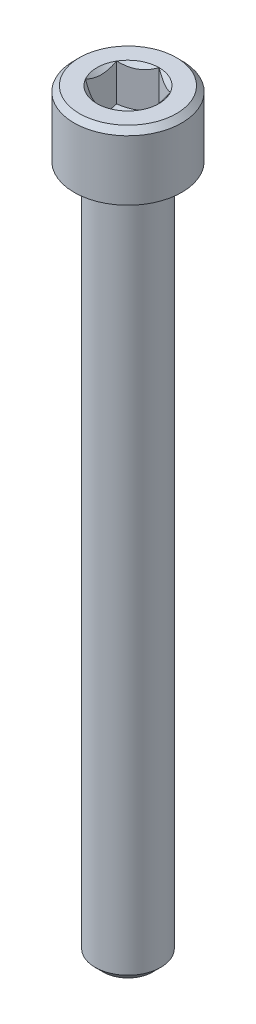
ISO-10303-21;
HEADER;
FILE_DESCRIPTION(('STEP AP214'),'2;1');
FILE_NAME('part.step','',(''),(''),'','','');
FILE_SCHEMA(('AUTOMOTIVE_DESIGN { 1 0 10303 214 1 1 1 1 }'));
ENDSEC;
DATA;
#1=APPLICATION_CONTEXT('core data for automotive mechanical design processes');
#2=APPLICATION_PROTOCOL_DEFINITION('international standard','automotive_design',2000,#1);
#3=PRODUCT_CONTEXT('',#1,'mechanical');
#4=PRODUCT('Part','Part','',(#3));
#5=PRODUCT_RELATED_PRODUCT_CATEGORY('part','',(#4));
#6=PRODUCT_DEFINITION_FORMATION('','',#4);
#7=PRODUCT_DEFINITION_CONTEXT('part definition',#1,'design');
#8=PRODUCT_DEFINITION('design','',#6,#7);
#9=PRODUCT_DEFINITION_SHAPE('','',#8);
#10=(LENGTH_UNIT() NAMED_UNIT(*) SI_UNIT(.MILLI.,.METRE.));
#11=(NAMED_UNIT(*) PLANE_ANGLE_UNIT() SI_UNIT($,.RADIAN.));
#12=(NAMED_UNIT(*) SI_UNIT($,.STERADIAN.) SOLID_ANGLE_UNIT());
#13=UNCERTAINTY_MEASURE_WITH_UNIT(LENGTH_MEASURE(1.E-05),#10,'distance_accuracy_value','');
#14=(GEOMETRIC_REPRESENTATION_CONTEXT(3) GLOBAL_UNCERTAINTY_ASSIGNED_CONTEXT((#13)) GLOBAL_UNIT_ASSIGNED_CONTEXT((#10,
#11,#12)) REPRESENTATION_CONTEXT('',''));
#15=CARTESIAN_POINT('',(0.,0.,0.));
#16=DIRECTION('',(0.,0.,1.));
#17=DIRECTION('',(1.,0.,0.));
#18=AXIS2_PLACEMENT_3D('',#15,#16,#17);
#19=CARTESIAN_POINT('',(0.,4.826,0.));
#20=DIRECTION('',(0.,1.,0.));
#21=DIRECTION('',(0.,0.,1.));
#22=AXIS2_PLACEMENT_3D('',#19,#20,#21);
#23=CONICAL_SURFACE('',#22,2.29135888084632,0.785398163397448);
#24=CARTESIAN_POINT('',(1.984575,4.82611547878185,1.14556397036933));
#25=CARTESIAN_POINT('',(1.9163590048332,4.78676285226392,1.18494849354192));
#26=CARTESIAN_POINT('',(1.84700231489304,4.74972131044619,1.22499159714897));
#27=CARTESIAN_POINT('',(1.70557619954781,4.68189885842333,1.30664400291398));
#28=CARTESIAN_POINT('',(1.63349332126322,4.65115568909176,1.34826107209555));
#29=CARTESIAN_POINT('',(1.488141602734,4.59849188881121,1.43217992591557));
#30=CARTESIAN_POINT('',(1.41490978751306,4.57643887587997,1.47446033414662));
#31=CARTESIAN_POINT('',(1.2668338174053,4.54246149294388,1.55995203534886));
#32=CARTESIAN_POINT('',(1.19199418724658,4.53051175609173,1.60316071596704));
#33=CARTESIAN_POINT('',(1.06301458545619,4.51973009908191,1.6776271237807));
#34=CARTESIAN_POINT('',(1.00904128422756,4.51813389905907,1.7087886237741));
#35=CARTESIAN_POINT('',(0.901182881480204,4.52082183886529,1.77106070163465));
#36=CARTESIAN_POINT('',(0.847297817514481,4.52510804034046,1.80217125782056));
#37=CARTESIAN_POINT('',(0.7400364617514,4.53931687301352,1.86409863044402));
#38=CARTESIAN_POINT('',(0.686660807239864,4.54924581045227,1.89491507894443));
#39=CARTESIAN_POINT('',(0.580832482591108,4.57419508427454,1.95601509066827));
#40=CARTESIAN_POINT('',(0.528379742028904,4.58921503038949,1.9862986945516));
#41=CARTESIAN_POINT('',(0.394017661036358,4.63380785163567,2.06387267818152));
#42=CARTESIAN_POINT('',(0.312941642841681,4.66674299593833,2.11068193911104));
#43=CARTESIAN_POINT('',(0.193726693270167,4.7223424412022,2.17951072233758));
#44=CARTESIAN_POINT('',(0.154440075614005,4.74187759205186,2.20219286161692));
#45=CARTESIAN_POINT('',(0.0765946381319541,4.7827287381194,2.24713694590236));
#46=CARTESIAN_POINT('',(0.0380353888983083,4.80404363956835,2.26939913882716));
#47=CARTESIAN_POINT('',(-0.000199999999994045,4.82611547878184,2.29147435090016));
#48=B_SPLINE_CURVE_WITH_KNOTS('',3,(#24,#25,#26,#27,#28,#29,#30,#31,#32,#33,#34,#35,#36,#37,#38,
#39,#40,#41,#42,#43,#44,#45,#46,#47),.UNSPECIFIED.,.F.,.F.,(4,2,2,2,2,2,2,2,2,2,2,4),(0.,
0.264339630306627,0.530219665093694,0.791876416371459,1.05287424418109,1.239639843932,
1.42647091743852,1.61351120244034,1.8005371524754,2.09764209964316,2.24579179873713,
2.39385111134156),.UNSPECIFIED.);
#49=CARTESIAN_POINT('',(1.984375,4.826,1.14567944042316));
#50=VERTEX_POINT('',#49);
#51=CARTESIAN_POINT('',(0.,4.826,2.29135888084632));
#52=VERTEX_POINT('',#51);
#53=EDGE_CURVE('E190',#50,#52,#48,.T.);
#54=ORIENTED_EDGE('',*,*,#53,.T.);
#55=CARTESIAN_POINT('',(0.,4.826,0.));
#56=DIRECTION('',(0.,1.,0.));
#57=DIRECTION('',(0.,0.,1.));
#58=AXIS2_PLACEMENT_3D('',#55,#56,#57);
#59=CIRCLE('',#58,2.29135888084632);
#60=EDGE_CURVE('E264',#52,#50,#59,.T.);
#61=ORIENTED_EDGE('',*,*,#60,.T.);
#62=EDGE_LOOP('',(#54,#61));
#63=FACE_BOUND('',#62,.T.);
#64=ADVANCED_FACE('F17',(#63),#23,.F.);
#65=CARTESIAN_POINT('',(-1.984375,4.826,1.14567944042317));
#66=VERTEX_POINT('',#65);
#67=EDGE_CURVE('E263',#66,#52,#59,.T.);
#68=ORIENTED_EDGE('',*,*,#67,.T.);
#69=CARTESIAN_POINT('',(0.000200000000006041,4.82611547878185,2.29147435090017));
#70=CARTESIAN_POINT('',(-0.0680159951667965,4.78676285226392,2.25208982772758));
#71=CARTESIAN_POINT('',(-0.13737268510696,4.74972131044619,2.21204672412052));
#72=CARTESIAN_POINT('',(-0.278798800452183,4.68189885842333,2.13039431835552));
#73=CARTESIAN_POINT('',(-0.350881678736778,4.65115568909176,2.08877724917394));
#74=CARTESIAN_POINT('',(-0.496233397266,4.59849188881122,2.00485839535392));
#75=CARTESIAN_POINT('',(-0.569465212486935,4.57643887587997,1.96257798712287));
#76=CARTESIAN_POINT('',(-0.717541182594702,4.54246149294388,1.87708628592063));
#77=CARTESIAN_POINT('',(-0.792380812753421,4.53051175609173,1.83387760530245));
#78=CARTESIAN_POINT('',(-0.921360414543811,4.51973009908191,1.75941119748879));
#79=CARTESIAN_POINT('',(-0.975333715772438,4.51813389905907,1.72824969749539));
#80=CARTESIAN_POINT('',(-1.0831921185198,4.52082183886529,1.66597761963484));
#81=CARTESIAN_POINT('',(-1.13707718248552,4.52510804034046,1.63486706344893));
#82=CARTESIAN_POINT('',(-1.2443385382486,4.53931687301352,1.57293969082547));
#83=CARTESIAN_POINT('',(-1.29771419276014,4.54924581045227,1.54212324232506));
#84=CARTESIAN_POINT('',(-1.40354251740889,4.57419508427454,1.48102323060122));
#85=CARTESIAN_POINT('',(-1.4559952579711,4.58921503038949,1.4507396267179));
#86=CARTESIAN_POINT('',(-1.59035733896364,4.63380785163567,1.37316564308797));
#87=CARTESIAN_POINT('',(-1.67143335715832,4.66674299593833,1.32635638215845));
#88=CARTESIAN_POINT('',(-1.79064830672984,4.7223424412022,1.25752759893191));
#89=CARTESIAN_POINT('',(-1.829934924386,4.74187759205186,1.23484545965257));
#90=CARTESIAN_POINT('',(-1.90778036186805,4.7827287381194,1.18990137536713));
#91=CARTESIAN_POINT('',(-1.9463396111017,4.80404363956835,1.16763918244233));
#92=CARTESIAN_POINT('',(-1.984575,4.82611547878184,1.14556397036933));
#93=B_SPLINE_CURVE_WITH_KNOTS('',3,(#69,#70,#71,#72,#73,#74,#75,#76,#77,#78,#79,#80,#81,#82,#83,
#84,#85,#86,#87,#88,#89,#90,#91,#92),.UNSPECIFIED.,.F.,.F.,(4,2,2,2,2,2,2,2,2,2,2,4),(0.,
0.264339630306629,0.530219665093699,0.791876416371465,1.0528742441811,1.23963984393201,
1.42647091743853,1.61351120244035,1.80053715247541,2.09764209964317,2.24579179873714,
2.39385111134158),.UNSPECIFIED.);
#94=EDGE_CURVE('E196',#52,#66,#93,.T.);
#95=ORIENTED_EDGE('',*,*,#94,.T.);
#96=EDGE_LOOP('',(#68,#95));
#97=FACE_BOUND('',#96,.T.);
#98=ADVANCED_FACE('F226',(#97),#23,.F.);
#99=CARTESIAN_POINT('',(1.984375,6.52130748324644,-3.45771088409132));
#100=CARTESIAN_POINT('',(1.984375,6.43262944586762,-3.35542683330867));
#101=CARTESIAN_POINT('',(1.984375,6.34446536162983,-3.25268780387356));
#102=CARTESIAN_POINT('',(1.984375,6.16953159373914,-3.04594702957406));
#103=CARTESIAN_POINT('',(1.984375,6.08276259352516,-2.94194470714936));
#104=CARTESIAN_POINT('',(1.984375,5.90909527980482,-2.73001070946145));
#105=CARTESIAN_POINT('',(1.984375,5.822239934163,-2.62204368545491));
#106=CARTESIAN_POINT('',(1.984375,5.65116778000237,-2.40407276272223));
#107=CARTESIAN_POINT('',(1.984375,5.56695031553371,-2.29406938136794));
#108=CARTESIAN_POINT('',(1.984375,5.402042566665,-2.07120370981882));
#109=CARTESIAN_POINT('',(1.984375,5.32135716597924,-1.95833778205997));
#110=CARTESIAN_POINT('',(1.984375,5.16517668266955,-1.72888861173673));
#111=CARTESIAN_POINT('',(1.984375,5.08968585678648,-1.61230243243413));
#112=CARTESIAN_POINT('',(1.984375,4.947134431062,-1.37524803754826));
#113=CARTESIAN_POINT('',(1.984375,4.8800132606332,-1.25481673054247));
#114=CARTESIAN_POINT('',(1.984375,4.75778822517673,-1.00801151762188));
#115=CARTESIAN_POINT('',(1.984375,4.70266224970091,-0.881649076411233));
#116=CARTESIAN_POINT('',(1.984375,4.63323107564838,-0.685684715970748));
#117=CARTESIAN_POINT('',(1.984375,4.61213776738587,-0.61849922209624));
#118=CARTESIAN_POINT('',(1.984375,4.57579445135076,-0.482546235656734));
#119=CARTESIAN_POINT('',(1.984375,4.56054351090578,-0.41377899746012));
#120=CARTESIAN_POINT('',(1.984375,4.53689825717652,-0.275490831109884));
#121=CARTESIAN_POINT('',(1.984375,4.52846218390903,-0.205977179571448));
#122=CARTESIAN_POINT('',(1.984375,4.51890880020465,-0.0664443832858304));
#123=CARTESIAN_POINT('',(1.984375,4.51779072084056,0.0035747075790733));
#124=CARTESIAN_POINT('',(1.984375,4.52296292884912,0.143424006703544));
#125=CARTESIAN_POINT('',(1.984375,4.52926289019542,0.213253849018881));
#126=CARTESIAN_POINT('',(1.984375,4.54881043261024,0.351927006353266));
#127=CARTESIAN_POINT('',(1.984375,4.56205938187111,0.420770124352072));
#128=CARTESIAN_POINT('',(1.984375,4.59475382728509,0.55745949001931));
#129=CARTESIAN_POINT('',(1.984375,4.61424263881878,0.625295193543097));
#130=CARTESIAN_POINT('',(1.984375,4.6583635263663,0.759246417792874));
#131=CARTESIAN_POINT('',(1.984375,4.68299565938668,0.825361919443687));
#132=CARTESIAN_POINT('',(1.984375,4.74245510304685,0.970580741117793));
#133=CARTESIAN_POINT('',(1.984375,4.77832893658829,1.04925193970017));
#134=CARTESIAN_POINT('',(1.984375,4.85486121641692,1.20425175336704));
#135=CARTESIAN_POINT('',(1.984375,4.89552242697314,1.28057898264071));
#136=CARTESIAN_POINT('',(1.984375,4.98056622739607,1.43132281685668));
#137=CARTESIAN_POINT('',(1.984375,5.02495635189839,1.50573513623634));
#138=CARTESIAN_POINT('',(1.984375,5.1165292817791,1.65278836739454));
#139=CARTESIAN_POINT('',(1.984375,5.16371153170412,1.72542962746702));
#140=CARTESIAN_POINT('',(1.984375,5.26051114971045,1.86962401155094));
#141=CARTESIAN_POINT('',(1.984375,5.31014010813647,1.9411693187575));
#142=CARTESIAN_POINT('',(1.984375,5.41114100200018,2.08302186505396));
#143=CARTESIAN_POINT('',(1.984375,5.46251306880154,2.1533290102246));
#144=CARTESIAN_POINT('',(1.984375,5.61857454823435,2.36253483271691));
#145=CARTESIAN_POINT('',(1.984375,5.72532842618644,2.49989159715618));
#146=CARTESIAN_POINT('',(1.984375,5.94598591328433,2.77607806575545));
#147=CARTESIAN_POINT('',(1.984375,6.06000910834152,2.91481128320863));
#148=CARTESIAN_POINT('',(1.984375,6.23243856402619,3.12046871280676));
#149=CARTESIAN_POINT('',(1.984375,6.28982890842778,3.1882488408292));
#150=CARTESIAN_POINT('',(1.984375,6.40517040906205,3.32332427251419));
#151=CARTESIAN_POINT('',(1.984375,6.46312153554217,3.39061960157108));
#152=CARTESIAN_POINT('',(1.984375,6.52130748324643,3.45771088409131));
#153=B_SPLINE_CURVE_WITH_KNOTS('',3,(#99,#100,#101,#102,#103,#104,#105,#106,#107,#108,#109,#110,
#111,#112,#113,#114,#115,#116,#117,#118,#119,#120,#121,#122,#123,#124,#125,#126,#127,#128,#129,
#130,#131,#132,#133,#134,#135,#136,#137,#138,#139,#140,#141,#142,#143,#144,#145,#146,#147,#148,
#149,#150,#151,#152),.UNSPECIFIED.,.F.,.F.,(4,2,2,2,2,2,2,2,2,2,2,2,2,2,2,2,2,2,2,2,2,2,2,2,2,2,
4),(0.,0.406127590682087,0.812448423474263,1.2281189762356,1.64368533200276,2.05980921904513,
2.47627013871692,2.88951664651822,3.30199485039354,3.51304063418481,3.72405271268915,
3.93376173343452,4.14344871896586,4.35340946345541,4.5634115628274,4.77490424990243,
4.98639928120368,5.24557242311816,5.50489595439299,5.76475669481382,6.02456591232051,
6.28575340350717,6.54696062214586,7.06874360549045,7.6074336441421,7.87387094807471,
8.1402941927268),.UNSPECIFIED.);
#154=CARTESIAN_POINT('',(1.984375,4.826,-1.14567944042317));
#155=VERTEX_POINT('',#154);
#156=EDGE_CURVE('E125',#155,#50,#153,.T.);
#157=ORIENTED_EDGE('',*,*,#156,.T.);
#158=EDGE_CURVE('E261',#50,#155,#59,.T.);
#159=ORIENTED_EDGE('',*,*,#158,.T.);
#160=EDGE_LOOP('',(#157,#159));
#161=FACE_BOUND('',#160,.T.);
#162=ADVANCED_FACE('F231',(#161),#23,.F.);
#163=CARTESIAN_POINT('',(-1.984375,4.826,-1.14567944042317));
#164=VERTEX_POINT('',#163);
#165=EDGE_CURVE('E259',#164,#66,#59,.T.);
#166=ORIENTED_EDGE('',*,*,#165,.T.);
#167=CARTESIAN_POINT('',(-1.984375,6.52130748324645,3.45771088409133));
#168=CARTESIAN_POINT('',(-1.984375,6.43262944586763,3.35542683330868));
#169=CARTESIAN_POINT('',(-1.984375,6.34446536162984,3.25268780387358));
#170=CARTESIAN_POINT('',(-1.984375,6.16953159373915,3.04594702957407));
#171=CARTESIAN_POINT('',(-1.984375,6.08276259352517,2.94194470714937));
#172=CARTESIAN_POINT('',(-1.984375,5.90909527980482,2.73001070946146));
#173=CARTESIAN_POINT('',(-1.984375,5.822239934163,2.62204368545493));
#174=CARTESIAN_POINT('',(-1.984375,5.65116778000238,2.40407276272225));
#175=CARTESIAN_POINT('',(-1.984375,5.56695031553373,2.29406938136795));
#176=CARTESIAN_POINT('',(-1.984375,5.40204256666501,2.07120370981883));
#177=CARTESIAN_POINT('',(-1.984375,5.32135716597925,1.95833778205998));
#178=CARTESIAN_POINT('',(-1.984375,5.16517668266955,1.72888861173674));
#179=CARTESIAN_POINT('',(-1.984375,5.08968585678649,1.61230243243414));
#180=CARTESIAN_POINT('',(-1.984375,4.947134431062,1.37524803754827));
#181=CARTESIAN_POINT('',(-1.984375,4.88001326063321,1.25481673054247));
#182=CARTESIAN_POINT('',(-1.984375,4.75778822517673,1.00801151762189));
#183=CARTESIAN_POINT('',(-1.984375,4.70266224970091,0.881649076411242));
#184=CARTESIAN_POINT('',(-1.984375,4.63323107564838,0.685684715970757));
#185=CARTESIAN_POINT('',(-1.984375,4.61213776738587,0.618499222096249));
#186=CARTESIAN_POINT('',(-1.984375,4.57579445135076,0.482546235656741));
#187=CARTESIAN_POINT('',(-1.984375,4.56054351090578,0.413778997460127));
#188=CARTESIAN_POINT('',(-1.984375,4.53689825717652,0.275490831109891));
#189=CARTESIAN_POINT('',(-1.984375,4.52846218390903,0.205977179571455));
#190=CARTESIAN_POINT('',(-1.984375,4.51890880020465,0.0664443832858369));
#191=CARTESIAN_POINT('',(-1.984375,4.51779072084056,-0.00357470757906708));
#192=CARTESIAN_POINT('',(-1.984375,4.52296292884912,-0.143424006703538));
#193=CARTESIAN_POINT('',(-1.984375,4.52926289019542,-0.213253849018876));
#194=CARTESIAN_POINT('',(-1.984375,4.54881043261024,-0.351927006353261));
#195=CARTESIAN_POINT('',(-1.984375,4.56205938187111,-0.420770124352067));
#196=CARTESIAN_POINT('',(-1.984375,4.59475382728509,-0.557459490019306));
#197=CARTESIAN_POINT('',(-1.984375,4.61424263881878,-0.625295193543094));
#198=CARTESIAN_POINT('',(-1.984375,4.6583635263663,-0.759246417792871));
#199=CARTESIAN_POINT('',(-1.984375,4.68299565938668,-0.825361919443685));
#200=CARTESIAN_POINT('',(-1.984375,4.74245510304685,-0.970580741117791));
#201=CARTESIAN_POINT('',(-1.984375,4.77832893658829,-1.04925193970017));
#202=CARTESIAN_POINT('',(-1.984375,4.85486121641691,-1.20425175336703));
#203=CARTESIAN_POINT('',(-1.984375,4.89552242697314,-1.28057898264071));
#204=CARTESIAN_POINT('',(-1.984375,4.98056622739607,-1.43132281685667));
#205=CARTESIAN_POINT('',(-1.984375,5.02495635189838,-1.50573513623633));
#206=CARTESIAN_POINT('',(-1.984375,5.1165292817791,-1.65278836739453));
#207=CARTESIAN_POINT('',(-1.984375,5.16371153170412,-1.72542962746701));
#208=CARTESIAN_POINT('',(-1.984375,5.26051114971045,-1.86962401155093));
#209=CARTESIAN_POINT('',(-1.984375,5.31014010813646,-1.9411693187575));
#210=CARTESIAN_POINT('',(-1.984375,5.41114100200017,-2.08302186505395));
#211=CARTESIAN_POINT('',(-1.984375,5.46251306880154,-2.15332901022459));
#212=CARTESIAN_POINT('',(-1.984375,5.61857454823435,-2.3625348327169));
#213=CARTESIAN_POINT('',(-1.984375,5.72532842618643,-2.49989159715617));
#214=CARTESIAN_POINT('',(-1.984375,5.94598591328432,-2.77607806575545));
#215=CARTESIAN_POINT('',(-1.984375,6.06000910834152,-2.91481128320863));
#216=CARTESIAN_POINT('',(-1.984375,6.2324385640262,-3.12046871280677));
#217=CARTESIAN_POINT('',(-1.984375,6.2898289084278,-3.18824884082921));
#218=CARTESIAN_POINT('',(-1.984375,6.40517040906206,-3.32332427251421));
#219=CARTESIAN_POINT('',(-1.984375,6.46312153554218,-3.3906196015711));
#220=CARTESIAN_POINT('',(-1.984375,6.52130748324645,-3.45771088409133));
#221=B_SPLINE_CURVE_WITH_KNOTS('',3,(#167,#168,#169,#170,#171,#172,#173,#174,#175,#176,#177,
#178,#179,#180,#181,#182,#183,#184,#185,#186,#187,#188,#189,#190,#191,#192,#193,#194,#195,#196,
#197,#198,#199,#200,#201,#202,#203,#204,#205,#206,#207,#208,#209,#210,#211,#212,#213,#214,#215,
#216,#217,#218,#219,#220),.UNSPECIFIED.,.F.,.F.,(4,2,2,2,2,2,2,2,2,2,2,2,2,2,2,2,2,2,2,2,2,2,2,
2,2,2,4),(0.,0.406127590682087,0.812448423474264,1.2281189762356,1.64368533200276,
2.05980921904514,2.47627013871693,2.88951664651823,3.30199485039355,3.51304063418482,
3.72405271268916,3.93376173343454,4.14344871896587,4.35340946345543,4.56341156282742,
4.77490424990244,4.9863992812037,5.24557242311818,5.504895954393,5.76475669481384,
6.02456591232052,6.28575340350718,6.54696062214588,7.06874360549046,7.60743364414213,
7.87387094807475,8.14029419272685),.UNSPECIFIED.);
#222=EDGE_CURVE('E206',#66,#164,#221,.T.);
#223=ORIENTED_EDGE('',*,*,#222,.T.);
#224=EDGE_LOOP('',(#166,#223));
#225=FACE_BOUND('',#224,.T.);
#226=ADVANCED_FACE('F244',(#225),#23,.F.);
#227=CARTESIAN_POINT('',(0.,4.826,-2.29135888084632));
#228=VERTEX_POINT('',#227);
#229=EDGE_CURVE('E255',#228,#164,#59,.T.);
#230=ORIENTED_EDGE('',*,*,#229,.T.);
#231=CARTESIAN_POINT('',(-1.984575,4.82611547878184,-1.14556397036933));
#232=CARTESIAN_POINT('',(-1.9163590048332,4.78676285226391,-1.18494849354192));
#233=CARTESIAN_POINT('',(-1.84700231489303,4.74972131044619,-1.22499159714897));
#234=CARTESIAN_POINT('',(-1.70557619954781,4.68189885842332,-1.30664400291398));
#235=CARTESIAN_POINT('',(-1.63349332126322,4.65115568909175,-1.34826107209555));
#236=CARTESIAN_POINT('',(-1.488141602734,4.59849188881121,-1.43217992591557));
#237=CARTESIAN_POINT('',(-1.41490978751306,4.57643887587997,-1.47446033414662));
#238=CARTESIAN_POINT('',(-1.2668338174053,4.54246149294388,-1.55995203534886));
#239=CARTESIAN_POINT('',(-1.19199418724658,4.53051175609173,-1.60316071596704));
#240=CARTESIAN_POINT('',(-1.06301458545619,4.51973009908191,-1.6776271237807));
#241=CARTESIAN_POINT('',(-1.00904128422756,4.51813389905907,-1.7087886237741));
#242=CARTESIAN_POINT('',(-0.901182881480203,4.52082183886529,-1.77106070163465));
#243=CARTESIAN_POINT('',(-0.84729781751448,4.52510804034046,-1.80217125782056));
#244=CARTESIAN_POINT('',(-0.740036461751399,4.53931687301352,-1.86409863044402));
#245=CARTESIAN_POINT('',(-0.686660807239862,4.54924581045227,-1.89491507894443));
#246=CARTESIAN_POINT('',(-0.580832482591107,4.57419508427454,-1.95601509066827));
#247=CARTESIAN_POINT('',(-0.528379742028903,4.58921503038949,-1.9862986945516));
#248=CARTESIAN_POINT('',(-0.394017661036357,4.63380785163567,-2.06387267818152));
#249=CARTESIAN_POINT('',(-0.31294164284168,4.66674299593833,-2.11068193911104));
#250=CARTESIAN_POINT('',(-0.193726693270166,4.7223424412022,-2.17951072233758));
#251=CARTESIAN_POINT('',(-0.154440075614005,4.74187759205186,-2.20219286161691));
#252=CARTESIAN_POINT('',(-0.0765946381319542,4.7827287381194,-2.24713694590236));
#253=CARTESIAN_POINT('',(-0.038035388898309,4.80404363956835,-2.26939913882716));
#254=CARTESIAN_POINT('',(0.000199999999992446,4.82611547878184,-2.29147435090016));
#255=B_SPLINE_CURVE_WITH_KNOTS('',3,(#231,#232,#233,#234,#235,#236,#237,#238,#239,#240,#241,
#242,#243,#244,#245,#246,#247,#248,#249,#250,#251,#252,#253,#254),.UNSPECIFIED.,.F.,.F.,(4,2,2,
2,2,2,2,2,2,2,2,4),(0.,0.264339630306625,0.530219665093691,0.791876416371454,1.05287424418108,
1.23963984393199,1.42647091743851,1.61351120244034,1.80053715247539,2.09764209964315,
2.24579179873712,2.39385111134156),.UNSPECIFIED.);
#256=EDGE_CURVE('E96',#164,#228,#255,.T.);
#257=ORIENTED_EDGE('',*,*,#256,.T.);
#258=EDGE_LOOP('',(#230,#257));
#259=FACE_BOUND('',#258,.T.);
#260=ADVANCED_FACE('F235',(#259),#23,.F.);
#261=CARTESIAN_POINT('',(0.,-25.0436663954414,0.));
#262=DIRECTION('',(0.,1.,0.));
#263=DIRECTION('',(0.,0.,1.));
#264=AXIS2_PLACEMENT_3D('',#261,#262,#263);
#265=CYLINDRICAL_SURFACE('',#264,3.96875);
#266=CARTESIAN_POINT('',(0.,4.429125,0.));
#267=DIRECTION('',(0.,1.,0.));
#268=DIRECTION('',(0.,0.,1.));
#269=AXIS2_PLACEMENT_3D('',#266,#267,#268);
#270=CIRCLE('',#269,3.96875);
#271=CARTESIAN_POINT('',(0.,4.429125,3.96875));
#272=VERTEX_POINT('',#271);
#273=EDGE_CURVE('E212',#272,#272,#270,.T.);
#274=ORIENTED_EDGE('',*,*,#273,.F.);
#275=EDGE_LOOP('',(#274));
#276=FACE_BOUND('',#275,.T.);
#277=CARTESIAN_POINT('',(0.,0.,0.));
#278=DIRECTION('',(0.,1.,0.));
#279=DIRECTION('',(0.,0.,1.));
#280=AXIS2_PLACEMENT_3D('',#277,#278,#279);
#281=CIRCLE('',#280,3.96875);
#282=CARTESIAN_POINT('',(0.,0.,3.96875));
#283=VERTEX_POINT('',#282);
#284=EDGE_CURVE('E11',#283,#283,#281,.T.);
#285=ORIENTED_EDGE('',*,*,#284,.T.);
#286=EDGE_LOOP('',(#285));
#287=FACE_BOUND('',#286,.T.);
#288=ADVANCED_FACE('F19',(#276,#287),#265,.T.);
#289=CARTESIAN_POINT('',(0.,0.,3.254375));
#290=DIRECTION('',(0.,1.,0.));
#291=DIRECTION('',(0.,0.,1.));
#292=AXIS2_PLACEMENT_3D('',#289,#290,#291);
#293=PLANE('',#292);
#294=ORIENTED_EDGE('',*,*,#284,.F.);
#295=EDGE_LOOP('',(#294));
#296=FACE_BOUND('',#295,.T.);
#297=CARTESIAN_POINT('',(0.,0.,0.));
#298=DIRECTION('',(0.,1.,0.));
#299=DIRECTION('',(0.,0.,1.));
#300=AXIS2_PLACEMENT_3D('',#297,#298,#299);
#301=CIRCLE('',#300,2.54);
#302=CARTESIAN_POINT('',(0.,0.,2.54));
#303=VERTEX_POINT('',#302);
#304=EDGE_CURVE('E25',#303,#303,#301,.T.);
#305=ORIENTED_EDGE('',*,*,#304,.T.);
#306=EDGE_LOOP('',(#305));
#307=FACE_BOUND('',#306,.T.);
#308=ADVANCED_FACE('F250',(#296,#307),#293,.F.);
#309=CARTESIAN_POINT('',(0.,-0.127,0.));
#310=DIRECTION('',(0.,1.,0.));
#311=DIRECTION('',(0.,0.,1.));
#312=AXIS2_PLACEMENT_3D('',#309,#310,#311);
#313=TOROIDAL_SURFACE('',#312,2.54,0.127);
#314=ORIENTED_EDGE('',*,*,#304,.F.);
#315=EDGE_LOOP('',(#314));
#316=FACE_BOUND('',#315,.T.);
#317=CARTESIAN_POINT('',(0.,-0.126999999999999,0.));
#318=DIRECTION('',(0.,1.,0.));
#319=DIRECTION('',(0.,0.,1.));
#320=AXIS2_PLACEMENT_3D('',#317,#318,#319);
#321=CIRCLE('',#320,2.413);
#322=CARTESIAN_POINT('',(0.,-0.126999999999999,2.413));
#323=VERTEX_POINT('',#322);
#324=EDGE_CURVE('E274',#323,#323,#321,.T.);
#325=ORIENTED_EDGE('',*,*,#324,.T.);
#326=EDGE_LOOP('',(#325));
#327=FACE_BOUND('',#326,.T.);
#328=ADVANCED_FACE('F280',(#316,#327),#313,.F.);
#329=CARTESIAN_POINT('',(0.,-25.0436663954414,0.));
#330=DIRECTION('',(0.,1.,0.));
#331=DIRECTION('',(0.,0.,1.));
#332=AXIS2_PLACEMENT_3D('',#329,#330,#331);
#333=CYLINDRICAL_SURFACE('',#332,2.413);
#334=ORIENTED_EDGE('',*,*,#324,.F.);
#335=EDGE_LOOP('',(#334));
#336=FACE_BOUND('',#335,.T.);
#337=CARTESIAN_POINT('',(0.,-50.2031,0.));
#338=DIRECTION('',(0.,1.,0.));
#339=DIRECTION('',(0.,0.,1.));
#340=AXIS2_PLACEMENT_3D('',#337,#338,#339);
#341=CIRCLE('',#340,2.413);
#342=CARTESIAN_POINT('',(0.,-50.2031,2.41299999999999));
#343=VERTEX_POINT('',#342);
#344=EDGE_CURVE('E271',#343,#343,#341,.T.);
#345=ORIENTED_EDGE('',*,*,#344,.T.);
#346=EDGE_LOOP('',(#345));
#347=FACE_BOUND('',#346,.T.);
#348=ADVANCED_FACE('F283',(#336,#347),#333,.T.);
#349=CARTESIAN_POINT('',(0.,-50.8,0.));
#350=DIRECTION('',(0.,1.,0.));
#351=DIRECTION('',(0.,0.,1.));
#352=AXIS2_PLACEMENT_3D('',#349,#350,#351);
#353=CONICAL_SURFACE('',#352,1.8161,0.785398163397457);
#354=ORIENTED_EDGE('',*,*,#344,.F.);
#355=EDGE_LOOP('',(#354));
#356=FACE_BOUND('',#355,.T.);
#357=CARTESIAN_POINT('',(0.,-50.8,0.));
#358=DIRECTION('',(0.,1.,0.));
#359=DIRECTION('',(0.,0.,1.));
#360=AXIS2_PLACEMENT_3D('',#357,#358,#359);
#361=CIRCLE('',#360,1.8161);
#362=CARTESIAN_POINT('',(0.,-50.8,1.81609999999999));
#363=VERTEX_POINT('',#362);
#364=EDGE_CURVE('E267',#363,#363,#361,.T.);
#365=ORIENTED_EDGE('',*,*,#364,.T.);
#366=EDGE_LOOP('',(#365));
#367=FACE_BOUND('',#366,.T.);
#368=ADVANCED_FACE('F241',(#356,#367),#353,.T.);
#369=CARTESIAN_POINT('',(0.,-50.8,0.90805));
#370=DIRECTION('',(0.,1.,0.));
#371=DIRECTION('',(0.,0.,1.));
#372=AXIS2_PLACEMENT_3D('',#369,#370,#371);
#373=PLANE('',#372);
#374=ORIENTED_EDGE('',*,*,#364,.F.);
#375=EDGE_LOOP('',(#374));
#376=FACE_BOUND('',#375,.T.);
#377=ADVANCED_FACE('F158',(#376),#373,.F.);
#378=EDGE_CURVE('E258',#155,#228,#59,.T.);
#379=ORIENTED_EDGE('',*,*,#378,.T.);
#380=CARTESIAN_POINT('',(-0.000200000000007589,4.82611547878185,-2.29147435090017));
#381=CARTESIAN_POINT('',(0.0680159951667949,4.78676285226392,-2.25208982772758));
#382=CARTESIAN_POINT('',(0.137372685106959,4.74972131044619,-2.21204672412052));
#383=CARTESIAN_POINT('',(0.278798800452181,4.68189885842333,-2.13039431835551));
#384=CARTESIAN_POINT('',(0.350881678736777,4.65115568909176,-2.08877724917394));
#385=CARTESIAN_POINT('',(0.496233397265999,4.59849188881122,-2.00485839535392));
#386=CARTESIAN_POINT('',(0.569465212486934,4.57643887587997,-1.96257798712287));
#387=CARTESIAN_POINT('',(0.717541182594702,4.54246149294388,-1.87708628592063));
#388=CARTESIAN_POINT('',(0.792380812753422,4.53051175609173,-1.83387760530245));
#389=CARTESIAN_POINT('',(0.921360414543813,4.51973009908191,-1.75941119748879));
#390=CARTESIAN_POINT('',(0.975333715772439,4.51813389905907,-1.72824969749539));
#391=CARTESIAN_POINT('',(1.0831921185198,4.52082183886529,-1.66597761963484));
#392=CARTESIAN_POINT('',(1.13707718248552,4.52510804034046,-1.63486706344893));
#393=CARTESIAN_POINT('',(1.2443385382486,4.53931687301352,-1.57293969082547));
#394=CARTESIAN_POINT('',(1.29771419276014,4.54924581045227,-1.54212324232506));
#395=CARTESIAN_POINT('',(1.40354251740889,4.57419508427454,-1.48102323060122));
#396=CARTESIAN_POINT('',(1.4559952579711,4.58921503038949,-1.45073962671789));
#397=CARTESIAN_POINT('',(1.59035733896364,4.63380785163567,-1.37316564308797));
#398=CARTESIAN_POINT('',(1.67143335715832,4.66674299593833,-1.32635638215845));
#399=CARTESIAN_POINT('',(1.79064830672984,4.7223424412022,-1.25752759893191));
#400=CARTESIAN_POINT('',(1.829934924386,4.74187759205186,-1.23484545965257));
#401=CARTESIAN_POINT('',(1.90778036186805,4.7827287381194,-1.18990137536713));
#402=CARTESIAN_POINT('',(1.9463396111017,4.80404363956835,-1.16763918244233));
#403=CARTESIAN_POINT('',(1.984575,4.82611547878184,-1.14556397036933));
#404=B_SPLINE_CURVE_WITH_KNOTS('',3,(#380,#381,#382,#383,#384,#385,#386,#387,#388,#389,#390,
#391,#392,#393,#394,#395,#396,#397,#398,#399,#400,#401,#402,#403),.UNSPECIFIED.,.F.,.F.,(4,2,2,
2,2,2,2,2,2,2,2,4),(0.,0.264339630306629,0.530219665093699,0.791876416371466,1.0528742441811,
1.23963984393201,1.42647091743853,1.61351120244035,1.80053715247541,2.09764209964317,
2.24579179873714,2.39385111134158),.UNSPECIFIED.);
#405=EDGE_CURVE('E31',#228,#155,#404,.T.);
#406=ORIENTED_EDGE('',*,*,#405,.T.);
#407=EDGE_LOOP('',(#379,#406));
#408=FACE_BOUND('',#407,.T.);
#409=ADVANCED_FACE('F132',(#408),#23,.F.);
#410=CARTESIAN_POINT('',(0.,4.826,2.93161694042316));
#411=DIRECTION('',(0.,1.,0.));
#412=DIRECTION('',(0.,0.,1.));
#413=AXIS2_PLACEMENT_3D('',#410,#411,#412);
#414=PLANE('',#413);
#415=CARTESIAN_POINT('',(0.,4.826,0.));
#416=DIRECTION('',(0.,1.,0.));
#417=DIRECTION('',(0.,0.,1.));
#418=AXIS2_PLACEMENT_3D('',#415,#416,#417);
#419=CIRCLE('',#418,3.571875);
#420=CARTESIAN_POINT('',(0.,4.826,3.571875));
#421=VERTEX_POINT('',#420);
#422=EDGE_CURVE('E268',#421,#421,#419,.T.);
#423=ORIENTED_EDGE('',*,*,#422,.T.);
#424=EDGE_LOOP('',(#423));
#425=FACE_BOUND('',#424,.T.);
#426=ORIENTED_EDGE('',*,*,#60,.F.);
#427=ORIENTED_EDGE('',*,*,#67,.F.);
#428=ORIENTED_EDGE('',*,*,#165,.F.);
#429=ORIENTED_EDGE('',*,*,#229,.F.);
#430=ORIENTED_EDGE('',*,*,#378,.F.);
#431=ORIENTED_EDGE('',*,*,#158,.F.);
#432=EDGE_LOOP('',(#426,#427,#428,#429,#430,#431));
#433=FACE_BOUND('',#432,.T.);
#434=ADVANCED_FACE('F234',(#425,#433),#414,.T.);
#435=CARTESIAN_POINT('',(0.,4.429125,0.));
#436=DIRECTION('',(0.,-1.,0.));
#437=DIRECTION('',(0.,0.,-1.));
#438=AXIS2_PLACEMENT_3D('',#435,#436,#437);
#439=CONICAL_SURFACE('',#438,3.96875,0.78539816339745);
#440=ORIENTED_EDGE('',*,*,#422,.F.);
#441=EDGE_LOOP('',(#440));
#442=FACE_BOUND('',#441,.T.);
#443=ORIENTED_EDGE('',*,*,#273,.T.);
#444=EDGE_LOOP('',(#443));
#445=FACE_BOUND('',#444,.T.);
#446=ADVANCED_FACE('F143',(#442,#445),#439,.T.);
#447=CARTESIAN_POINT('',(-1.984375,-1.1106512134823,0.));
#448=DIRECTION('',(-1.,0.,0.));
#449=DIRECTION('',(0.,0.,1.));
#450=AXIS2_PLACEMENT_3D('',#447,#448,#449);
#451=PLANE('',#450);
#452=ORIENTED_EDGE('',*,*,#222,.F.);
#453=DIRECTION('',(0.,1.,0.));
#454=VECTOR('',#453,1.);
#455=CARTESIAN_POINT('',(-1.984375,-1.1106512134823,1.14567944042317));
#456=LINE('',#455,#454);
#457=CARTESIAN_POINT('',(-1.984375,2.08945452467681,1.14567944042317));
#458=VERTEX_POINT('',#457);
#459=EDGE_CURVE('E80',#458,#66,#456,.T.);
#460=ORIENTED_EDGE('',*,*,#459,.F.);
#461=CARTESIAN_POINT('',(-1.984375,4.42690590287542,-5.85436456510873));
#462=CARTESIAN_POINT('',(-1.984375,4.35588977333528,-5.7295632914009));
#463=CARTESIAN_POINT('',(-1.984375,4.28504525904714,-5.60466411462751));
#464=CARTESIAN_POINT('',(-1.984375,4.14378184169921,-5.35462320385655));
#465=CARTESIAN_POINT('',(-1.984375,4.07336294423939,-5.22948146669602));
#466=CARTESIAN_POINT('',(-1.984375,3.86279955126345,-4.85349954828695));
#467=CARTESIAN_POINT('',(-1.984375,3.72342088659338,-4.60222973342794));
#468=CARTESIAN_POINT('',(-1.984375,3.44532150214495,-4.09354827294376));
#469=CARTESIAN_POINT('',(-1.984375,3.30665564054008,-3.83610641521805));
#470=CARTESIAN_POINT('',(-1.984375,3.1026760457673,-3.4478641870196));
#471=CARTESIAN_POINT('',(-1.984375,3.03535982886417,-3.31811778611126));
#472=CARTESIAN_POINT('',(-1.984375,2.90252103290933,-3.05771181575714));
#473=CARTESIAN_POINT('',(-1.984375,2.83699840326312,-2.92705227220056));
#474=CARTESIAN_POINT('',(-1.984375,2.70251106828089,-2.65258581347795));
#475=CARTESIAN_POINT('',(-1.984375,2.63377654243134,-2.50866550174565));
#476=CARTESIAN_POINT('',(-1.984375,2.50041004150475,-2.21887100441734));
#477=CARTESIAN_POINT('',(-1.984375,2.43577916207758,-2.07299630949728));
#478=CARTESIAN_POINT('',(-1.984375,2.31278760505755,-1.77909828864268));
#479=CARTESIAN_POINT('',(-1.984375,2.25440918103385,-1.63108247464689));
#480=CARTESIAN_POINT('',(-1.984375,2.14680535241344,-1.33172418244179));
#481=CARTESIAN_POINT('',(-1.984375,2.09757584845007,-1.18038322828851));
#482=CARTESIAN_POINT('',(-1.984375,2.02659350968816,-0.923330403581485));
#483=CARTESIAN_POINT('',(-1.984375,2.00110150498184,-0.818666325060485));
#484=CARTESIAN_POINT('',(-1.984375,1.95822925638616,-0.607678025855774));
#485=CARTESIAN_POINT('',(-1.984375,1.94084644098805,-0.501354342518225));
#486=CARTESIAN_POINT('',(-1.984375,1.91589057691193,-0.288238830241303));
#487=CARTESIAN_POINT('',(-1.984375,1.90825325724032,-0.181454778048271));
#488=CARTESIAN_POINT('',(-1.984375,1.90342915050395,0.0323480596777573));
#489=CARTESIAN_POINT('',(-1.984375,1.9062418379514,0.139366833137127));
#490=CARTESIAN_POINT('',(-1.984375,1.92376727381035,0.376366051555176));
#491=CARTESIAN_POINT('',(-1.984375,1.94098769581022,0.50615932510805));
#492=CARTESIAN_POINT('',(-1.984375,1.98805756970463,0.763434105332206));
#493=CARTESIAN_POINT('',(-1.984375,2.01791766687064,0.8909135686896));
#494=CARTESIAN_POINT('',(-1.984375,2.08778292156683,1.14586487289779));
#495=CARTESIAN_POINT('',(-1.984375,2.12798732256046,1.27328071713379));
#496=CARTESIAN_POINT('',(-1.984375,2.19352840838852,1.46252740118767));
#497=CARTESIAN_POINT('',(-1.984375,2.2162461419508,1.52529261118087));
#498=CARTESIAN_POINT('',(-1.984375,2.26316080249081,1.65026823952602));
#499=CARTESIAN_POINT('',(-1.984375,2.28735770562137,1.71247866680365));
#500=CARTESIAN_POINT('',(-1.984375,2.3494998494132,1.86763713423447));
#501=CARTESIAN_POINT('',(-1.984375,2.38822677604846,1.96027125624634));
#502=CARTESIAN_POINT('',(-1.984375,2.46785672721174,2.14460225768426));
#503=CARTESIAN_POINT('',(-1.984375,2.50875993722951,2.23629905642345));
#504=CARTESIAN_POINT('',(-1.984375,2.63402283493443,2.51028267483398));
#505=CARTESIAN_POINT('',(-1.984375,2.7209139442596,2.69140985357735));
#506=CARTESIAN_POINT('',(-1.984375,2.89906871634569,3.05178783835767));
#507=CARTESIAN_POINT('',(-1.984375,2.99033832092699,3.23103566791592));
#508=CARTESIAN_POINT('',(-1.984375,3.17574141958964,3.58805097493485));
#509=CARTESIAN_POINT('',(-1.984375,3.26987505156938,3.7658183805889));
#510=CARTESIAN_POINT('',(-1.984375,3.45131637099216,4.10386455026829));
#511=CARTESIAN_POINT('',(-1.984375,3.538448575724,4.26423787944478));
#512=CARTESIAN_POINT('',(-1.984375,3.71393414109542,4.58432496888202));
#513=CARTESIAN_POINT('',(-1.984375,3.80228756396531,4.74403869498838));
#514=CARTESIAN_POINT('',(-1.984375,3.9796191344674,5.06242098987328));
#515=CARTESIAN_POINT('',(-1.984375,4.06859421819799,5.22109126791615));
#516=CARTESIAN_POINT('',(-1.984375,4.24725992927077,5.53801313064387));
#517=CARTESIAN_POINT('',(-1.984375,4.33695050303506,5.69626474551931));
#518=CARTESIAN_POINT('',(-1.984375,4.42690590287542,5.85436456510873));
#519=B_SPLINE_CURVE_WITH_KNOTS('',3,(#461,#462,#463,#464,#465,#466,#467,#468,#469,#470,#471,
#472,#473,#474,#475,#476,#477,#478,#479,#480,#481,#482,#483,#484,#485,#486,#487,#488,#489,#490,
#491,#492,#493,#494,#495,#496,#497,#498,#499,#500,#501,#502,#503,#504,#505,#506,#507,#508,#509,
#510,#511,#512,#513,#514,#515,#516,#517,#518),.UNSPECIFIED.,.F.,.F.,(4,2,2,2,2,2,2,2,2,2,2,2,2,
2,2,2,2,2,2,2,2,2,2,2,2,2,2,2,4),(0.,0.43077598014733,0.86155761585606,1.7235598234942,
2.60074943761128,3.03924870835695,3.47773559690274,3.95616691296619,4.43472543488823,
4.91188749900691,5.38883524237575,5.71175873233177,6.0345797501453,6.35526058812353,
6.67592530060242,7.06791248496861,7.46023046411401,7.86075912977084,8.06099644755658,
8.26123053796692,8.56240284285517,8.86360085861743,9.46616836322798,10.0695780837202,
10.6730169035567,11.2205550033425,11.7681211079588,12.3138620910025,12.8595625840278),.UNSPECIFIED.);
#520=CARTESIAN_POINT('',(-1.984375,2.08945452467681,-1.14567944042317));
#521=VERTEX_POINT('',#520);
#522=EDGE_CURVE('E72',#521,#458,#519,.T.);
#523=ORIENTED_EDGE('',*,*,#522,.F.);
#524=DIRECTION('',(0.,1.,0.));
#525=VECTOR('',#524,1.);
#526=CARTESIAN_POINT('',(-1.984375,-1.1106512134823,-1.14567944042317));
#527=LINE('',#526,#525);
#528=EDGE_CURVE('E77',#521,#164,#527,.T.);
#529=ORIENTED_EDGE('',*,*,#528,.T.);
#530=EDGE_LOOP('',(#452,#460,#523,#529));
#531=FACE_BOUND('',#530,.T.);
#532=ADVANCED_FACE('F75',(#531),#451,.F.);
#533=CARTESIAN_POINT('',(-0.9921875,-1.1106512134823,1.71851916063474));
#534=DIRECTION('',(-0.5,0.,0.866025403784439));
#535=DIRECTION('',(0.866025403784439,0.,0.5));
#536=AXIS2_PLACEMENT_3D('',#533,#534,#535);
#537=PLANE('',#536);
#538=ORIENTED_EDGE('',*,*,#94,.F.);
#539=DIRECTION('',(0.,1.,0.));
#540=VECTOR('',#539,1.);
#541=CARTESIAN_POINT('',(0.,-1.1106512134823,2.29135888084632));
#542=LINE('',#541,#540);
#543=CARTESIAN_POINT('',(0.,2.08945452467681,2.29135888084632));
#544=VERTEX_POINT('',#543);
#545=EDGE_CURVE('E98',#544,#52,#542,.T.);
#546=ORIENTED_EDGE('',*,*,#545,.F.);
#547=CARTESIAN_POINT('',(-1.984575,2.08952391132915,1.14556397036933));
#548=CARTESIAN_POINT('',(-1.89705460835446,2.05914988425222,1.19609389204546));
#549=CARTESIAN_POINT('',(-1.80871593451387,2.03151291970104,1.24709624916718));
#550=CARTESIAN_POINT('',(-1.63037606865432,1.98328530268078,1.35006081872843));
#551=CARTESIAN_POINT('',(-1.54037109014686,1.9627135240882,1.40202521729812));
#552=CARTESIAN_POINT('',(-1.36157025703134,1.9308008905659,1.5052559264287));
#553=CARTESIAN_POINT('',(-1.27280675615278,1.91922716833824,1.55650355755515));
#554=CARTESIAN_POINT('',(-1.09483713007289,1.90555342459226,1.65925436907995));
#555=CARTESIAN_POINT('',(-1.00563177151199,1.90344053342442,1.71075710685824));
#556=CARTESIAN_POINT('',(-0.839733404475869,1.90849444412372,1.80653857372466));
#557=CARTESIAN_POINT('',(-0.763009503767488,1.91442305566002,1.85083513845193));
#558=CARTESIAN_POINT('',(-0.610105360744215,1.93299548491518,1.93911438658662));
#559=CARTESIAN_POINT('',(-0.533925746040508,1.9456460813446,1.98309670764257));
#560=CARTESIAN_POINT('',(-0.380689466082018,1.97718918590136,2.07156771512622));
#561=CARTESIAN_POINT('',(-0.303655281302755,1.99622350145743,2.11604342244533));
#562=CARTESIAN_POINT('',(-0.150821953691098,2.03934788758007,2.20428178528307));
#563=CARTESIAN_POINT('',(-0.0750205197574408,2.06342704656956,2.24804576356962));
#564=CARTESIAN_POINT('',(0.000200000000006011,2.08952391132915,2.29147435090017));
#565=B_SPLINE_CURVE_WITH_KNOTS('',3,(#547,#548,#549,#550,#551,#552,#553,#554,#555,#556,#557,
#558,#559,#560,#561,#562,#563,#564),.UNSPECIFIED.,.F.,.F.,(4,2,2,2,2,2,2,2,4),(0.,
0.316717009096852,0.634273629527878,0.943309807734603,1.2519254734173,1.51802915880327,
1.78440170418935,2.05713355507813,2.3292814894869),.UNSPECIFIED.);
#566=EDGE_CURVE('E83',#458,#544,#565,.T.);
#567=ORIENTED_EDGE('',*,*,#566,.F.);
#568=ORIENTED_EDGE('',*,*,#459,.T.);
#569=EDGE_LOOP('',(#538,#546,#567,#568));
#570=FACE_BOUND('',#569,.T.);
#571=ADVANCED_FACE('F185',(#570),#537,.F.);
#572=CARTESIAN_POINT('',(0.9921875,-1.1106512134823,1.71851916063474));
#573=DIRECTION('',(0.5,0.,0.866025403784439));
#574=DIRECTION('',(0.866025403784439,0.,-0.5));
#575=AXIS2_PLACEMENT_3D('',#572,#573,#574);
#576=PLANE('',#575);
#577=ORIENTED_EDGE('',*,*,#53,.F.);
#578=DIRECTION('',(0.,1.,0.));
#579=VECTOR('',#578,1.);
#580=CARTESIAN_POINT('',(1.984375,-1.1106512134823,1.14567944042315));
#581=LINE('',#580,#579);
#582=CARTESIAN_POINT('',(1.984375,2.08945452467681,1.14567944042316));
#583=VERTEX_POINT('',#582);
#584=EDGE_CURVE('E111',#583,#50,#581,.T.);
#585=ORIENTED_EDGE('',*,*,#584,.F.);
#586=CARTESIAN_POINT('',(-0.000199999999994145,2.08952391132915,2.29147435090016));
#587=CARTESIAN_POINT('',(0.0873203916455413,2.05914988425222,2.24094442922403));
#588=CARTESIAN_POINT('',(0.175659065486135,2.03151291970104,2.18994207210231));
#589=CARTESIAN_POINT('',(0.353998931345687,1.98328530268078,2.08697750254105));
#590=CARTESIAN_POINT('',(0.444003909853141,1.9627135240882,2.03501310397137));
#591=CARTESIAN_POINT('',(0.622804742968664,1.9308008905659,1.93178239484079));
#592=CARTESIAN_POINT('',(0.711568243847223,1.91922716833824,1.88053476371434));
#593=CARTESIAN_POINT('',(0.889537869927107,1.90555342459226,1.77778395218955));
#594=CARTESIAN_POINT('',(0.978743228488007,1.90344053342442,1.72628121441125));
#595=CARTESIAN_POINT('',(1.14464159552413,1.90849444412372,1.63049974754483));
#596=CARTESIAN_POINT('',(1.22136549623251,1.91442305566002,1.58620318281757));
#597=CARTESIAN_POINT('',(1.37426963925578,1.93299548491518,1.49792393468287));
#598=CARTESIAN_POINT('',(1.45044925395949,1.9456460813446,1.45394161362692));
#599=CARTESIAN_POINT('',(1.60368553391798,1.97718918590136,1.36547060614327));
#600=CARTESIAN_POINT('',(1.68071971869724,1.99622350145743,1.32099489882416));
#601=CARTESIAN_POINT('',(1.8335530463089,2.03934788758006,1.23275653598643));
#602=CARTESIAN_POINT('',(1.90935448024255,2.06342704656956,1.18899255769987));
#603=CARTESIAN_POINT('',(1.984575,2.08952391132915,1.14556397036933));
#604=B_SPLINE_CURVE_WITH_KNOTS('',3,(#586,#587,#588,#589,#590,#591,#592,#593,#594,#595,#596,
#597,#598,#599,#600,#601,#602,#603),.UNSPECIFIED.,.F.,.F.,(4,2,2,2,2,2,2,2,4),(0.,
0.316717009096851,0.634273629527875,0.943309807734599,1.25192547341729,1.51802915880326,
1.78440170418934,2.05713355507812,2.32928148948689),.UNSPECIFIED.);
#605=EDGE_CURVE('E176',#544,#583,#604,.T.);
#606=ORIENTED_EDGE('',*,*,#605,.F.);
#607=ORIENTED_EDGE('',*,*,#545,.T.);
#608=EDGE_LOOP('',(#577,#585,#606,#607));
#609=FACE_BOUND('',#608,.T.);
#610=ADVANCED_FACE('F182',(#609),#576,.F.);
#611=CARTESIAN_POINT('',(-0.9921875,-1.1106512134823,-1.71851916063474));
#612=DIRECTION('',(-0.5,0.,-0.866025403784439));
#613=DIRECTION('',(-0.866025403784439,0.,0.5));
#614=AXIS2_PLACEMENT_3D('',#611,#612,#613);
#615=PLANE('',#614);
#616=ORIENTED_EDGE('',*,*,#256,.F.);
#617=ORIENTED_EDGE('',*,*,#528,.F.);
#618=CARTESIAN_POINT('',(0.00019999999999241,2.08952391132915,-2.29147435090016));
#619=CARTESIAN_POINT('',(-0.0873203916455424,2.05914988425222,-2.24094442922403));
#620=CARTESIAN_POINT('',(-0.175659065486136,2.03151291970104,-2.18994207210231));
#621=CARTESIAN_POINT('',(-0.353998931345688,1.98328530268078,-2.08697750254105));
#622=CARTESIAN_POINT('',(-0.444003909853142,1.9627135240882,-2.03501310397137));
#623=CARTESIAN_POINT('',(-0.622804742968665,1.9308008905659,-1.93178239484079));
#624=CARTESIAN_POINT('',(-0.711568243847223,1.91922716833825,-1.88053476371434));
#625=CARTESIAN_POINT('',(-0.889537869927108,1.90555342459226,-1.77778395218954));
#626=CARTESIAN_POINT('',(-0.978743228488009,1.90344053342442,-1.72628121441125));
#627=CARTESIAN_POINT('',(-1.14464159552413,1.90849444412372,-1.63049974754483));
#628=CARTESIAN_POINT('',(-1.22136549623251,1.91442305566002,-1.58620318281757));
#629=CARTESIAN_POINT('',(-1.37426963925578,1.93299548491518,-1.49792393468287));
#630=CARTESIAN_POINT('',(-1.45044925395949,1.9456460813446,-1.45394161362692));
#631=CARTESIAN_POINT('',(-1.60368553391798,1.97718918590136,-1.36547060614327));
#632=CARTESIAN_POINT('',(-1.68071971869724,1.99622350145743,-1.32099489882416));
#633=CARTESIAN_POINT('',(-1.83355304630889,2.03934788758006,-1.23275653598643));
#634=CARTESIAN_POINT('',(-1.90935448024255,2.06342704656956,-1.18899255769987));
#635=CARTESIAN_POINT('',(-1.984575,2.08952391132915,-1.14556397036933));
#636=B_SPLINE_CURVE_WITH_KNOTS('',3,(#618,#619,#620,#621,#622,#623,#624,#625,#626,#627,#628,
#629,#630,#631,#632,#633,#634,#635),.UNSPECIFIED.,.F.,.F.,(4,2,2,2,2,2,2,2,4),(0.,
0.316717009096851,0.634273629527876,0.943309807734599,1.25192547341729,1.51802915880326,
1.78440170418933,2.05713355507812,2.32928148948688),.UNSPECIFIED.);
#637=CARTESIAN_POINT('',(0.,2.08945452467681,-2.29135888084632));
#638=VERTEX_POINT('',#637);
#639=EDGE_CURVE('E84',#638,#521,#636,.T.);
#640=ORIENTED_EDGE('',*,*,#639,.F.);
#641=DIRECTION('',(0.,1.,0.));
#642=VECTOR('',#641,1.);
#643=CARTESIAN_POINT('',(0.,-1.1106512134823,-2.29135888084632));
#644=LINE('',#643,#642);
#645=EDGE_CURVE('E116',#638,#228,#644,.T.);
#646=ORIENTED_EDGE('',*,*,#645,.T.);
#647=EDGE_LOOP('',(#616,#617,#640,#646));
#648=FACE_BOUND('',#647,.T.);
#649=ADVANCED_FACE('F95',(#648),#615,.F.);
#650=CARTESIAN_POINT('',(1.984375,-1.1106512134823,0.));
#651=DIRECTION('',(1.,0.,0.));
#652=DIRECTION('',(0.,0.,-1.));
#653=AXIS2_PLACEMENT_3D('',#650,#651,#652);
#654=PLANE('',#653);
#655=ORIENTED_EDGE('',*,*,#156,.F.);
#656=DIRECTION('',(0.,1.,0.));
#657=VECTOR('',#656,1.);
#658=CARTESIAN_POINT('',(1.984375,-1.1106512134823,-1.14567944042317));
#659=LINE('',#658,#657);
#660=CARTESIAN_POINT('',(1.984375,2.08945452467681,-1.14567944042317));
#661=VERTEX_POINT('',#660);
#662=EDGE_CURVE('E114',#661,#155,#659,.T.);
#663=ORIENTED_EDGE('',*,*,#662,.F.);
#664=CARTESIAN_POINT('',(1.984375,4.42690590287541,5.85436456510871));
#665=CARTESIAN_POINT('',(1.984375,4.35588977333527,5.72956329140088));
#666=CARTESIAN_POINT('',(1.984375,4.28504525904713,5.60466411462749));
#667=CARTESIAN_POINT('',(1.984375,4.1437818416992,5.35462320385653));
#668=CARTESIAN_POINT('',(1.984375,4.07336294423938,5.229481466696));
#669=CARTESIAN_POINT('',(1.984375,3.86279955126344,4.85349954828693));
#670=CARTESIAN_POINT('',(1.984375,3.72342088659337,4.60222973342792));
#671=CARTESIAN_POINT('',(1.984375,3.44532150214494,4.09354827294375));
#672=CARTESIAN_POINT('',(1.984375,3.30665564054007,3.83610641521804));
#673=CARTESIAN_POINT('',(1.984375,3.1026760457673,3.44786418701959));
#674=CARTESIAN_POINT('',(1.984375,3.03535982886417,3.31811778611125));
#675=CARTESIAN_POINT('',(1.984375,2.90252103290932,3.05771181575713));
#676=CARTESIAN_POINT('',(1.984375,2.83699840326312,2.92705227220055));
#677=CARTESIAN_POINT('',(1.984375,2.70251106828089,2.65258581347794));
#678=CARTESIAN_POINT('',(1.984375,2.63377654243134,2.50866550174564));
#679=CARTESIAN_POINT('',(1.984375,2.50041004150475,2.21887100441734));
#680=CARTESIAN_POINT('',(1.984375,2.43577916207757,2.07299630949728));
#681=CARTESIAN_POINT('',(1.984375,2.31278760505754,1.77909828864267));
#682=CARTESIAN_POINT('',(1.984375,2.25440918103384,1.63108247464688));
#683=CARTESIAN_POINT('',(1.984375,2.14680535241344,1.33172418244178));
#684=CARTESIAN_POINT('',(1.984375,2.09757584845006,1.18038322828851));
#685=CARTESIAN_POINT('',(1.984375,2.02659350968816,0.923330403581477));
#686=CARTESIAN_POINT('',(1.984375,2.00110150498183,0.818666325060477));
#687=CARTESIAN_POINT('',(1.984375,1.95822925638616,0.607678025855766));
#688=CARTESIAN_POINT('',(1.984375,1.94084644098805,0.501354342518217));
#689=CARTESIAN_POINT('',(1.984375,1.91589057691193,0.288238830241296));
#690=CARTESIAN_POINT('',(1.984375,1.90825325724032,0.181454778048264));
#691=CARTESIAN_POINT('',(1.984375,1.90342915050395,-0.0323480596777638));
#692=CARTESIAN_POINT('',(1.984375,1.9062418379514,-0.139366833137134));
#693=CARTESIAN_POINT('',(1.984375,1.92376727381035,-0.376366051555183));
#694=CARTESIAN_POINT('',(1.984375,1.94098769581022,-0.506159325108057));
#695=CARTESIAN_POINT('',(1.984375,1.98805756970463,-0.763434105332214));
#696=CARTESIAN_POINT('',(1.984375,2.01791766687065,-0.890913568689609));
#697=CARTESIAN_POINT('',(1.984375,2.08778292156683,-1.1458648728978));
#698=CARTESIAN_POINT('',(1.984375,2.12798732256047,-1.2732807171338));
#699=CARTESIAN_POINT('',(1.984375,2.19352840838852,-1.46252740118768));
#700=CARTESIAN_POINT('',(1.984375,2.2162461419508,-1.52529261118088));
#701=CARTESIAN_POINT('',(1.984375,2.26316080249082,-1.65026823952603));
#702=CARTESIAN_POINT('',(1.984375,2.28735770562138,-1.71247866680366));
#703=CARTESIAN_POINT('',(1.984375,2.3494998494132,-1.86763713423448));
#704=CARTESIAN_POINT('',(1.984375,2.38822677604847,-1.96027125624635));
#705=CARTESIAN_POINT('',(1.984375,2.46785672721175,-2.14460225768427));
#706=CARTESIAN_POINT('',(1.984375,2.50875993722952,-2.23629905642346));
#707=CARTESIAN_POINT('',(1.984375,2.63402283493444,-2.51028267483398));
#708=CARTESIAN_POINT('',(1.984375,2.72091394425961,-2.69140985357736));
#709=CARTESIAN_POINT('',(1.984375,2.89906871634569,-3.05178783835767));
#710=CARTESIAN_POINT('',(1.984375,2.99033832092699,-3.23103566791593));
#711=CARTESIAN_POINT('',(1.984375,3.17574141958964,-3.58805097493485));
#712=CARTESIAN_POINT('',(1.984375,3.26987505156938,-3.76581838058889));
#713=CARTESIAN_POINT('',(1.984375,3.45131637099216,-4.10386455026828));
#714=CARTESIAN_POINT('',(1.984375,3.538448575724,-4.26423787944477));
#715=CARTESIAN_POINT('',(1.984375,3.71393414109542,-4.58432496888201));
#716=CARTESIAN_POINT('',(1.984375,3.80228756396531,-4.74403869498837));
#717=CARTESIAN_POINT('',(1.984375,3.9796191344674,-5.06242098987327));
#718=CARTESIAN_POINT('',(1.984375,4.06859421819799,-5.22109126791614));
#719=CARTESIAN_POINT('',(1.984375,4.24725992927077,-5.53801313064386));
#720=CARTESIAN_POINT('',(1.984375,4.33695050303505,-5.6962647455193));
#721=CARTESIAN_POINT('',(1.984375,4.42690590287541,-5.85436456510872));
#722=B_SPLINE_CURVE_WITH_KNOTS('',3,(#664,#665,#666,#667,#668,#669,#670,#671,#672,#673,#674,
#675,#676,#677,#678,#679,#680,#681,#682,#683,#684,#685,#686,#687,#688,#689,#690,#691,#692,#693,
#694,#695,#696,#697,#698,#699,#700,#701,#702,#703,#704,#705,#706,#707,#708,#709,#710,#711,#712,
#713,#714,#715,#716,#717,#718,#719,#720,#721),.UNSPECIFIED.,.F.,.F.,(4,2,2,2,2,2,2,2,2,2,2,2,2,
2,2,2,2,2,2,2,2,2,2,2,2,2,2,2,4),(0.,0.430775980147328,0.861557615856057,1.72355982349419,
2.60074943761126,3.03924870835693,3.47773559690273,3.95616691296618,4.43472543488822,
4.9118874990069,5.38883524237574,5.71175873233175,6.03457975014528,6.35526058812352,
6.6759253006024,7.0679124849686,7.46023046411399,7.86075912977083,8.06099644755657,
8.26123053796691,8.56240284285516,8.86360085861742,9.46616836322797,10.0695780837202,
10.6730169035567,11.2205550033424,11.7681211079587,12.3138620910024,12.8595625840278),.UNSPECIFIED.);
#723=EDGE_CURVE('E100',#583,#661,#722,.T.);
#724=ORIENTED_EDGE('',*,*,#723,.F.);
#725=ORIENTED_EDGE('',*,*,#584,.T.);
#726=EDGE_LOOP('',(#655,#663,#724,#725));
#727=FACE_BOUND('',#726,.T.);
#728=ADVANCED_FACE('F139',(#727),#654,.F.);
#729=CARTESIAN_POINT('',(0.9921875,-1.1106512134823,-1.71851916063474));
#730=DIRECTION('',(0.5,0.,-0.866025403784439));
#731=DIRECTION('',(-0.866025403784439,0.,-0.5));
#732=AXIS2_PLACEMENT_3D('',#729,#730,#731);
#733=PLANE('',#732);
#734=ORIENTED_EDGE('',*,*,#405,.F.);
#735=ORIENTED_EDGE('',*,*,#645,.F.);
#736=CARTESIAN_POINT('',(1.984575,2.08952391132915,-1.14556397036933));
#737=CARTESIAN_POINT('',(1.89705460835446,2.05914988425222,-1.19609389204546));
#738=CARTESIAN_POINT('',(1.80871593451387,2.03151291970104,-1.24709624916718));
#739=CARTESIAN_POINT('',(1.63037606865432,1.98328530268078,-1.35006081872843));
#740=CARTESIAN_POINT('',(1.54037109014686,1.9627135240882,-1.40202521729812));
#741=CARTESIAN_POINT('',(1.36157025703134,1.9308008905659,-1.5052559264287));
#742=CARTESIAN_POINT('',(1.27280675615278,1.91922716833825,-1.55650355755515));
#743=CARTESIAN_POINT('',(1.09483713007289,1.90555342459226,-1.65925436907994));
#744=CARTESIAN_POINT('',(1.00563177151199,1.90344053342442,-1.71075710685824));
#745=CARTESIAN_POINT('',(0.83973340447587,1.90849444412372,-1.80653857372466));
#746=CARTESIAN_POINT('',(0.763009503767488,1.91442305566002,-1.85083513845192));
#747=CARTESIAN_POINT('',(0.610105360744214,1.93299548491519,-1.93911438658662));
#748=CARTESIAN_POINT('',(0.533925746040508,1.9456460813446,-1.98309670764257));
#749=CARTESIAN_POINT('',(0.380689466082017,1.97718918590136,-2.07156771512622));
#750=CARTESIAN_POINT('',(0.303655281302753,1.99622350145743,-2.11604342244533));
#751=CARTESIAN_POINT('',(0.150821953691096,2.03934788758007,-2.20428178528307));
#752=CARTESIAN_POINT('',(0.0750205197574386,2.06342704656957,-2.24804576356962));
#753=CARTESIAN_POINT('',(-0.000200000000007519,2.08952391132916,-2.29147435090017));
#754=B_SPLINE_CURVE_WITH_KNOTS('',3,(#736,#737,#738,#739,#740,#741,#742,#743,#744,#745,#746,
#747,#748,#749,#750,#751,#752,#753),.UNSPECIFIED.,.F.,.F.,(4,2,2,2,2,2,2,2,4),(0.,
0.316717009096852,0.634273629527879,0.943309807734604,1.2519254734173,1.51802915880327,
1.78440170418935,2.05713355507814,2.3292814894869),.UNSPECIFIED.);
#755=EDGE_CURVE('E89',#661,#638,#754,.T.);
#756=ORIENTED_EDGE('',*,*,#755,.F.);
#757=ORIENTED_EDGE('',*,*,#662,.T.);
#758=EDGE_LOOP('',(#734,#735,#756,#757));
#759=FACE_BOUND('',#758,.T.);
#760=ADVANCED_FACE('F135',(#759),#733,.F.);
#761=CARTESIAN_POINT('',(0.,1.905,0.));
#762=DIRECTION('',(0.,1.,0.));
#763=DIRECTION('',(0.,0.,1.));
#764=AXIS2_PLACEMENT_3D('',#761,#762,#763);
#765=CONICAL_SURFACE('',#764,1.984375,1.02974425867665);
#766=CARTESIAN_POINT('',(0.,0.712667209117186,0.));
#767=VERTEX_POINT('',#766);
#768=VERTEX_LOOP('',#767);
#769=FACE_BOUND('',#768,.T.);
#770=ORIENTED_EDGE('',*,*,#566,.T.);
#771=ORIENTED_EDGE('',*,*,#605,.T.);
#772=ORIENTED_EDGE('',*,*,#723,.T.);
#773=ORIENTED_EDGE('',*,*,#755,.T.);
#774=ORIENTED_EDGE('',*,*,#639,.T.);
#775=ORIENTED_EDGE('',*,*,#522,.T.);
#776=EDGE_LOOP('',(#770,#771,#772,#773,#774,#775));
#777=FACE_BOUND('',#776,.T.);
#778=ADVANCED_FACE('F87',(#769,#777),#765,.F.);
#779=CLOSED_SHELL('',(#64,#98,#162,#226,#260,#288,#308,#328,#348,#368,#377,#409,#434,#446,#532,
#571,#610,#649,#728,#760,#778));
#780=MANIFOLD_SOLID_BREP('B1',#779);
#781=ADVANCED_BREP_SHAPE_REPRESENTATION('',(#18,#780),#14);
#782=SHAPE_DEFINITION_REPRESENTATION(#9,#781);
ENDSEC;
END-ISO-10303-21;
